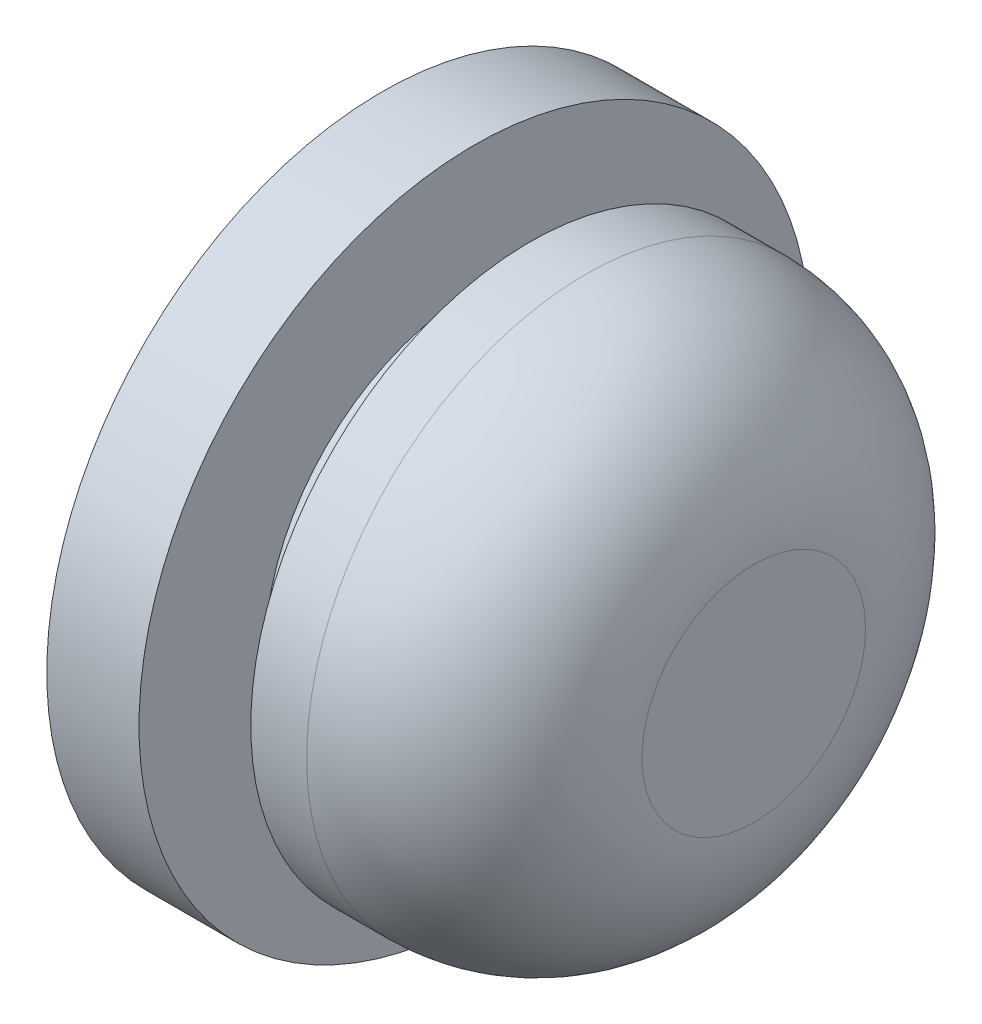
ISO-10303-21;
HEADER;
FILE_DESCRIPTION(('STEP AP214'),'2;1');
FILE_NAME('part.step','',(''),(''),'','','');
FILE_SCHEMA(('AUTOMOTIVE_DESIGN { 1 0 10303 214 1 1 1 1 }'));
ENDSEC;
DATA;
#1=APPLICATION_CONTEXT('core data for automotive mechanical design processes');
#2=APPLICATION_PROTOCOL_DEFINITION('international standard','automotive_design',2000,#1);
#3=PRODUCT_CONTEXT('',#1,'mechanical');
#4=PRODUCT('Part','Part','',(#3));
#5=PRODUCT_RELATED_PRODUCT_CATEGORY('part','',(#4));
#6=PRODUCT_DEFINITION_FORMATION('','',#4);
#7=PRODUCT_DEFINITION_CONTEXT('part definition',#1,'design');
#8=PRODUCT_DEFINITION('design','',#6,#7);
#9=PRODUCT_DEFINITION_SHAPE('','',#8);
#10=(LENGTH_UNIT() NAMED_UNIT(*) SI_UNIT(.MILLI.,.METRE.));
#11=(NAMED_UNIT(*) PLANE_ANGLE_UNIT() SI_UNIT($,.RADIAN.));
#12=(NAMED_UNIT(*) SI_UNIT($,.STERADIAN.) SOLID_ANGLE_UNIT());
#13=UNCERTAINTY_MEASURE_WITH_UNIT(LENGTH_MEASURE(1.E-05),#10,'distance_accuracy_value','');
#14=(GEOMETRIC_REPRESENTATION_CONTEXT(3) GLOBAL_UNCERTAINTY_ASSIGNED_CONTEXT((#13)) GLOBAL_UNIT_ASSIGNED_CONTEXT((#10,
#11,#12)) REPRESENTATION_CONTEXT('',''));
#15=CARTESIAN_POINT('',(0.,0.,0.));
#16=DIRECTION('',(0.,0.,1.));
#17=DIRECTION('',(1.,0.,0.));
#18=AXIS2_PLACEMENT_3D('',#15,#16,#17);
#19=CARTESIAN_POINT('',(3.30000000000003,0.,0.));
#20=DIRECTION('',(1.,0.,0.));
#21=DIRECTION('',(0.,0.,-1.));
#22=AXIS2_PLACEMENT_3D('',#19,#20,#21);
#23=PLANE('',#22);
#24=CARTESIAN_POINT('',(3.30000000000003,0.,0.));
#25=DIRECTION('',(1.,0.,0.));
#26=DIRECTION('',(0.,0.,-1.));
#27=AXIS2_PLACEMENT_3D('',#24,#25,#26);
#28=CIRCLE('',#27,12.);
#29=CARTESIAN_POINT('',(3.30000000000003,0.,-12.));
#30=VERTEX_POINT('',#29);
#31=EDGE_CURVE('E57',#30,#30,#28,.T.);
#32=ORIENTED_EDGE('',*,*,#31,.T.);
#33=EDGE_LOOP('',(#32));
#34=FACE_BOUND('',#33,.T.);
#35=CARTESIAN_POINT('',(3.30000000000003,0.,0.));
#36=DIRECTION('',(1.,0.,0.));
#37=DIRECTION('',(0.,0.,-1.));
#38=AXIS2_PLACEMENT_3D('',#35,#36,#37);
#39=CIRCLE('',#38,7.5);
#40=CARTESIAN_POINT('',(3.30000000000003,0.,-7.5));
#41=VERTEX_POINT('',#40);
#42=EDGE_CURVE('E70',#41,#41,#39,.T.);
#43=ORIENTED_EDGE('',*,*,#42,.F.);
#44=EDGE_LOOP('',(#43));
#45=FACE_BOUND('',#44,.T.);
#46=ADVANCED_FACE('F46',(#34,#45),#23,.T.);
#47=CARTESIAN_POINT('',(0.,0.,0.));
#48=DIRECTION('',(1.,0.,0.));
#49=DIRECTION('',(0.,0.,-1.));
#50=AXIS2_PLACEMENT_3D('',#47,#48,#49);
#51=PLANE('',#50);
#52=CARTESIAN_POINT('',(0.,0.,0.));
#53=DIRECTION('',(1.,0.,0.));
#54=DIRECTION('',(0.,0.,-1.));
#55=AXIS2_PLACEMENT_3D('',#52,#53,#54);
#56=CIRCLE('',#55,12.);
#57=CARTESIAN_POINT('',(0.,0.,-12.));
#58=VERTEX_POINT('',#57);
#59=EDGE_CURVE('E61',#58,#58,#56,.T.);
#60=ORIENTED_EDGE('',*,*,#59,.F.);
#61=EDGE_LOOP('',(#60));
#62=FACE_BOUND('',#61,.T.);
#63=CARTESIAN_POINT('',(0.,0.,0.));
#64=DIRECTION('',(1.,0.,0.));
#65=DIRECTION('',(0.,0.,-1.));
#66=AXIS2_PLACEMENT_3D('',#63,#64,#65);
#67=CIRCLE('',#66,4.);
#68=CARTESIAN_POINT('',(0.,0.,-4.));
#69=VERTEX_POINT('',#68);
#70=EDGE_CURVE('E65',#69,#69,#67,.T.);
#71=ORIENTED_EDGE('',*,*,#70,.T.);
#72=EDGE_LOOP('',(#71));
#73=FACE_BOUND('',#72,.T.);
#74=ADVANCED_FACE('F103',(#62,#73),#51,.F.);
#75=CARTESIAN_POINT('',(3.30000000000003,0.,0.));
#76=DIRECTION('',(-1.,0.,0.));
#77=DIRECTION('',(0.,0.,1.));
#78=AXIS2_PLACEMENT_3D('',#75,#76,#77);
#79=CYLINDRICAL_SURFACE('',#78,12.);
#80=ORIENTED_EDGE('',*,*,#31,.F.);
#81=EDGE_LOOP('',(#80));
#82=FACE_BOUND('',#81,.T.);
#83=ORIENTED_EDGE('',*,*,#59,.T.);
#84=EDGE_LOOP('',(#83));
#85=FACE_BOUND('',#84,.T.);
#86=ADVANCED_FACE('F109',(#82,#85),#79,.T.);
#87=CARTESIAN_POINT('',(3.30000000000003,0.,0.));
#88=DIRECTION('',(-1.,0.,0.));
#89=DIRECTION('',(0.,0.,1.));
#90=AXIS2_PLACEMENT_3D('',#87,#88,#89);
#91=CYLINDRICAL_SURFACE('',#90,4.);
#92=ORIENTED_EDGE('',*,*,#70,.F.);
#93=EDGE_LOOP('',(#92));
#94=FACE_BOUND('',#93,.T.);
#95=CARTESIAN_POINT('',(5.30000000000003,0.,0.));
#96=DIRECTION('',(1.,0.,0.));
#97=DIRECTION('',(0.,0.,-1.));
#98=AXIS2_PLACEMENT_3D('',#95,#96,#97);
#99=CIRCLE('',#98,4.);
#100=CARTESIAN_POINT('',(5.30000000000003,0.,-4.));
#101=VERTEX_POINT('',#100);
#102=EDGE_CURVE('E73',#101,#101,#99,.T.);
#103=ORIENTED_EDGE('',*,*,#102,.T.);
#104=EDGE_LOOP('',(#103));
#105=FACE_BOUND('',#104,.T.);
#106=ADVANCED_FACE('F96',(#94,#105),#91,.F.);
#107=CARTESIAN_POINT('',(5.30000000000003,0.,0.));
#108=DIRECTION('',(-1.,0.,0.));
#109=DIRECTION('',(0.,0.,1.));
#110=AXIS2_PLACEMENT_3D('',#107,#108,#109);
#111=CYLINDRICAL_SURFACE('',#110,7.5);
#112=CARTESIAN_POINT('',(5.30000000000003,0.,0.));
#113=DIRECTION('',(1.,0.,0.));
#114=DIRECTION('',(0.,0.,-1.));
#115=AXIS2_PLACEMENT_3D('',#112,#113,#114);
#116=CIRCLE('',#115,7.5);
#117=CARTESIAN_POINT('',(5.30000000000003,0.,-7.5));
#118=VERTEX_POINT('',#117);
#119=EDGE_CURVE('E69',#118,#118,#116,.T.);
#120=ORIENTED_EDGE('',*,*,#119,.F.);
#121=EDGE_LOOP('',(#120));
#122=FACE_BOUND('',#121,.T.);
#123=ORIENTED_EDGE('',*,*,#42,.T.);
#124=EDGE_LOOP('',(#123));
#125=FACE_BOUND('',#124,.T.);
#126=ADVANCED_FACE('F87',(#122,#125),#111,.T.);
#127=CARTESIAN_POINT('',(5.30000000000003,0.,0.));
#128=DIRECTION('',(1.,0.,0.));
#129=DIRECTION('',(0.,0.,-1.));
#130=AXIS2_PLACEMENT_3D('',#127,#128,#129);
#131=PLANE('',#130);
#132=ORIENTED_EDGE('',*,*,#119,.T.);
#133=EDGE_LOOP('',(#132));
#134=FACE_BOUND('',#133,.T.);
#135=CARTESIAN_POINT('',(5.30000000000003,0.,0.));
#136=DIRECTION('',(1.,0.,0.));
#137=DIRECTION('',(0.,0.,-1.));
#138=AXIS2_PLACEMENT_3D('',#135,#136,#137);
#139=CIRCLE('',#138,10.);
#140=CARTESIAN_POINT('',(5.30000000000003,0.,-9.99999999999999));
#141=VERTEX_POINT('',#140);
#142=EDGE_CURVE('E78',#141,#141,#139,.T.);
#143=ORIENTED_EDGE('',*,*,#142,.F.);
#144=EDGE_LOOP('',(#143));
#145=FACE_BOUND('',#144,.T.);
#146=ADVANCED_FACE('F84',(#134,#145),#131,.F.);
#147=CARTESIAN_POINT('',(13.3,0.,0.));
#148=DIRECTION('',(1.,0.,0.));
#149=DIRECTION('',(0.,0.,-1.));
#150=AXIS2_PLACEMENT_3D('',#147,#148,#149);
#151=PLANE('',#150);
#152=CARTESIAN_POINT('',(13.3,0.,0.));
#153=DIRECTION('',(1.,0.,0.));
#154=DIRECTION('',(0.,0.,-1.));
#155=AXIS2_PLACEMENT_3D('',#152,#153,#154);
#156=CIRCLE('',#155,4.);
#157=CARTESIAN_POINT('',(13.3,0.,-4.));
#158=VERTEX_POINT('',#157);
#159=EDGE_CURVE('E53',#158,#158,#156,.T.);
#160=ORIENTED_EDGE('',*,*,#159,.T.);
#161=EDGE_LOOP('',(#160));
#162=FACE_BOUND('',#161,.T.);
#163=ADVANCED_FACE('F86',(#162),#151,.T.);
#164=CARTESIAN_POINT('',(13.3,0.,0.));
#165=DIRECTION('',(-1.,0.,0.));
#166=DIRECTION('',(0.,0.,1.));
#167=AXIS2_PLACEMENT_3D('',#164,#165,#166);
#168=CYLINDRICAL_SURFACE('',#167,10.);
#169=CARTESIAN_POINT('',(7.29999999999997,0.,0.));
#170=DIRECTION('',(1.,0.,0.));
#171=DIRECTION('',(0.,0.,-1.));
#172=AXIS2_PLACEMENT_3D('',#169,#170,#171);
#173=CIRCLE('',#172,10.);
#174=CARTESIAN_POINT('',(7.29999999999997,0.,-9.99999999999999));
#175=VERTEX_POINT('',#174);
#176=EDGE_CURVE('E12',#175,#175,#173,.F.);
#177=ORIENTED_EDGE('',*,*,#176,.T.);
#178=EDGE_LOOP('',(#177));
#179=FACE_BOUND('',#178,.T.);
#180=ORIENTED_EDGE('',*,*,#142,.T.);
#181=EDGE_LOOP('',(#180));
#182=FACE_BOUND('',#181,.T.);
#183=ADVANCED_FACE('F82',(#179,#182),#168,.T.);
#184=ORIENTED_EDGE('',*,*,#102,.F.);
#185=EDGE_LOOP('',(#184));
#186=FACE_BOUND('',#185,.T.);
#187=ADVANCED_FACE('F90',(#186),#131,.F.);
#188=CARTESIAN_POINT('',(7.29999999999997,0.,0.));
#189=DIRECTION('',(1.,0.,0.));
#190=DIRECTION('',(0.,0.,-1.));
#191=AXIS2_PLACEMENT_3D('',#188,#189,#190);
#192=DEGENERATE_TOROIDAL_SURFACE('',#191,4.,6.,.T.);
#193=ORIENTED_EDGE('',*,*,#176,.F.);
#194=EDGE_LOOP('',(#193));
#195=FACE_BOUND('',#194,.T.);
#196=ORIENTED_EDGE('',*,*,#159,.F.);
#197=EDGE_LOOP('',(#196));
#198=FACE_BOUND('',#197,.T.);
#199=ADVANCED_FACE('F48',(#195,#198),#192,.T.);
#200=CLOSED_SHELL('',(#46,#74,#86,#106,#126,#146,#163,#183,#187,#199));
#201=MANIFOLD_SOLID_BREP('B2',#200);
#202=ADVANCED_BREP_SHAPE_REPRESENTATION('',(#18,#201),#14);
#203=SHAPE_DEFINITION_REPRESENTATION(#9,#202);
ENDSEC;
END-ISO-10303-21;
